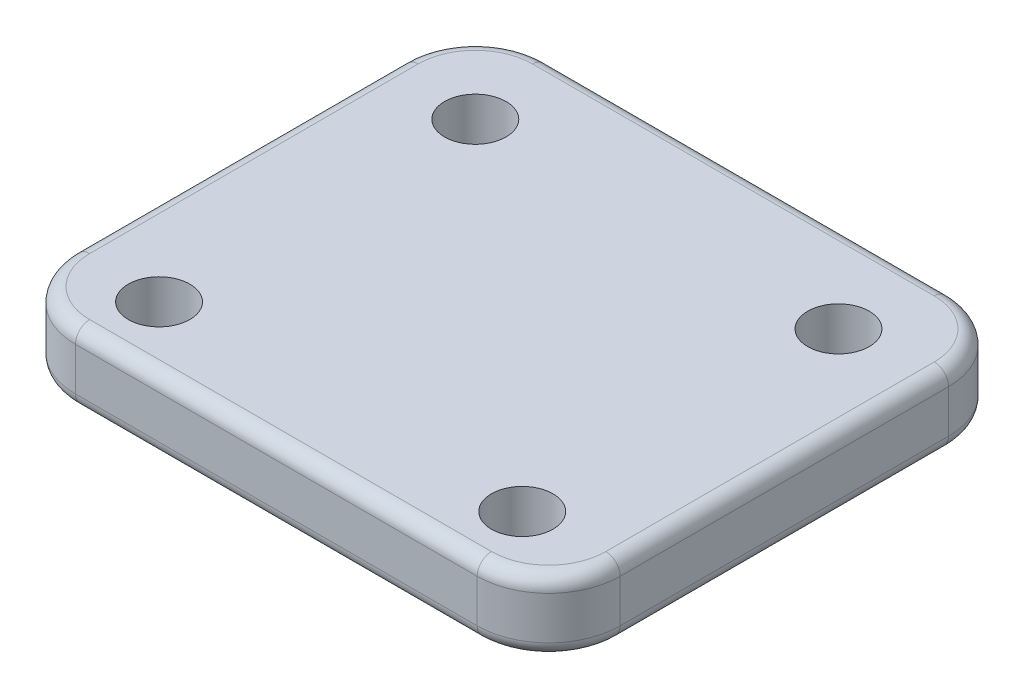
ISO-10303-21;
HEADER;
FILE_DESCRIPTION(('STEP AP214'),'2;1');
FILE_NAME('part.step','',(''),(''),'','','');
FILE_SCHEMA(('AUTOMOTIVE_DESIGN { 1 0 10303 214 1 1 1 1 }'));
ENDSEC;
DATA;
#1=APPLICATION_CONTEXT('core data for automotive mechanical design processes');
#2=APPLICATION_PROTOCOL_DEFINITION('international standard','automotive_design',2000,#1);
#3=PRODUCT_CONTEXT('',#1,'mechanical');
#4=PRODUCT('Part','Part','',(#3));
#5=PRODUCT_RELATED_PRODUCT_CATEGORY('part','',(#4));
#6=PRODUCT_DEFINITION_FORMATION('','',#4);
#7=PRODUCT_DEFINITION_CONTEXT('part definition',#1,'design');
#8=PRODUCT_DEFINITION('design','',#6,#7);
#9=PRODUCT_DEFINITION_SHAPE('','',#8);
#10=(LENGTH_UNIT() NAMED_UNIT(*) SI_UNIT(.MILLI.,.METRE.));
#11=(NAMED_UNIT(*) PLANE_ANGLE_UNIT() SI_UNIT($,.RADIAN.));
#12=(NAMED_UNIT(*) SI_UNIT($,.STERADIAN.) SOLID_ANGLE_UNIT());
#13=UNCERTAINTY_MEASURE_WITH_UNIT(LENGTH_MEASURE(1.E-05),#10,'distance_accuracy_value','');
#14=(GEOMETRIC_REPRESENTATION_CONTEXT(3) GLOBAL_UNCERTAINTY_ASSIGNED_CONTEXT((#13)) GLOBAL_UNIT_ASSIGNED_CONTEXT((#10,
#11,#12)) REPRESENTATION_CONTEXT('',''));
#15=CARTESIAN_POINT('',(0.,0.,0.));
#16=DIRECTION('',(0.,0.,1.));
#17=DIRECTION('',(1.,0.,0.));
#18=AXIS2_PLACEMENT_3D('',#15,#16,#17);
#19=CARTESIAN_POINT('',(0.,5.,0.));
#20=DIRECTION('',(0.,1.,0.));
#21=DIRECTION('',(0.,0.,1.));
#22=AXIS2_PLACEMENT_3D('',#19,#20,#21);
#23=PLANE('',#22);
#24=DIRECTION('',(0.,0.,1.));
#25=VECTOR('',#24,1.);
#26=CARTESIAN_POINT('',(1.,5.,27.97));
#27=LINE('',#26,#25);
#28=CARTESIAN_POINT('',(1.,5.,5.));
#29=VERTEX_POINT('',#28);
#30=CARTESIAN_POINT('',(1.,5.,27.97));
#31=VERTEX_POINT('',#30);
#32=EDGE_CURVE('E57',#29,#31,#27,.T.);
#33=ORIENTED_EDGE('',*,*,#32,.T.);
#34=CARTESIAN_POINT('',(5.,5.,27.97));
#35=DIRECTION('',(0.,1.,0.));
#36=DIRECTION('',(0.,0.,1.));
#37=AXIS2_PLACEMENT_3D('',#34,#35,#36);
#38=CIRCLE('',#37,4.);
#39=CARTESIAN_POINT('',(5.,5.,31.97));
#40=VERTEX_POINT('',#39);
#41=EDGE_CURVE('E270',#31,#40,#38,.T.);
#42=ORIENTED_EDGE('',*,*,#41,.T.);
#43=DIRECTION('',(1.,0.,0.));
#44=VECTOR('',#43,1.);
#45=CARTESIAN_POINT('',(33.1,5.,31.97));
#46=LINE('',#45,#44);
#47=CARTESIAN_POINT('',(33.1,5.,31.97));
#48=VERTEX_POINT('',#47);
#49=EDGE_CURVE('E251',#40,#48,#46,.T.);
#50=ORIENTED_EDGE('',*,*,#49,.T.);
#51=CARTESIAN_POINT('',(33.1,5.,27.97));
#52=DIRECTION('',(0.,1.,0.));
#53=DIRECTION('',(0.,0.,1.));
#54=AXIS2_PLACEMENT_3D('',#51,#52,#53);
#55=CIRCLE('',#54,4.);
#56=CARTESIAN_POINT('',(37.1,5.,27.97));
#57=VERTEX_POINT('',#56);
#58=EDGE_CURVE('E254',#48,#57,#55,.T.);
#59=ORIENTED_EDGE('',*,*,#58,.T.);
#60=DIRECTION('',(0.,0.,-1.));
#61=VECTOR('',#60,1.);
#62=CARTESIAN_POINT('',(37.1,5.,5.));
#63=LINE('',#62,#61);
#64=CARTESIAN_POINT('',(37.1,5.,5.));
#65=VERTEX_POINT('',#64);
#66=EDGE_CURVE('E257',#57,#65,#63,.T.);
#67=ORIENTED_EDGE('',*,*,#66,.T.);
#68=CARTESIAN_POINT('',(33.1,5.,5.));
#69=DIRECTION('',(0.,1.,0.));
#70=DIRECTION('',(0.,0.,1.));
#71=AXIS2_PLACEMENT_3D('',#68,#69,#70);
#72=CIRCLE('',#71,4.);
#73=CARTESIAN_POINT('',(33.1,5.,1.));
#74=VERTEX_POINT('',#73);
#75=EDGE_CURVE('E260',#65,#74,#72,.T.);
#76=ORIENTED_EDGE('',*,*,#75,.T.);
#77=DIRECTION('',(-1.,0.,0.));
#78=VECTOR('',#77,1.);
#79=CARTESIAN_POINT('',(5.,5.,1.));
#80=LINE('',#79,#78);
#81=CARTESIAN_POINT('',(5.,5.,1.));
#82=VERTEX_POINT('',#81);
#83=EDGE_CURVE('E263',#74,#82,#80,.T.);
#84=ORIENTED_EDGE('',*,*,#83,.T.);
#85=CARTESIAN_POINT('',(5.,5.,5.));
#86=DIRECTION('',(0.,1.,0.));
#87=DIRECTION('',(0.,0.,1.));
#88=AXIS2_PLACEMENT_3D('',#85,#86,#87);
#89=CIRCLE('',#88,4.);
#90=EDGE_CURVE('E62',#82,#29,#89,.T.);
#91=ORIENTED_EDGE('',*,*,#90,.T.);
#92=EDGE_LOOP('',(#33,#42,#50,#59,#67,#76,#84,#91));
#93=FACE_BOUND('',#92,.T.);
#94=CARTESIAN_POINT('',(31.7500000000002,5.,28.47));
#95=DIRECTION('',(0.,1.,0.));
#96=DIRECTION('',(0.,0.,1.));
#97=AXIS2_PLACEMENT_3D('',#94,#95,#96);
#98=CIRCLE('',#97,2.15);
#99=CARTESIAN_POINT('',(31.7500000000002,5.,30.62));
#100=VERTEX_POINT('',#99);
#101=EDGE_CURVE('E386',#100,#100,#98,.T.);
#102=ORIENTED_EDGE('',*,*,#101,.F.);
#103=EDGE_LOOP('',(#102));
#104=FACE_BOUND('',#103,.T.);
#105=CARTESIAN_POINT('',(6.35,5.,6.35));
#106=DIRECTION('',(0.,1.,0.));
#107=DIRECTION('',(0.,0.,1.));
#108=AXIS2_PLACEMENT_3D('',#105,#106,#107);
#109=CIRCLE('',#108,2.15);
#110=CARTESIAN_POINT('',(6.35,5.,8.5));
#111=VERTEX_POINT('',#110);
#112=EDGE_CURVE('E373',#111,#111,#109,.T.);
#113=ORIENTED_EDGE('',*,*,#112,.F.);
#114=EDGE_LOOP('',(#113));
#115=FACE_BOUND('',#114,.T.);
#116=CARTESIAN_POINT('',(31.75,5.,6.35));
#117=DIRECTION('',(0.,1.,0.));
#118=DIRECTION('',(0.,0.,1.));
#119=AXIS2_PLACEMENT_3D('',#116,#117,#118);
#120=CIRCLE('',#119,2.15);
#121=CARTESIAN_POINT('',(31.75,5.,8.5));
#122=VERTEX_POINT('',#121);
#123=EDGE_CURVE('E378',#122,#122,#120,.T.);
#124=ORIENTED_EDGE('',*,*,#123,.F.);
#125=EDGE_LOOP('',(#124));
#126=FACE_BOUND('',#125,.T.);
#127=CARTESIAN_POINT('',(6.35000000000023,5.,28.47));
#128=DIRECTION('',(0.,1.,0.));
#129=DIRECTION('',(0.,0.,1.));
#130=AXIS2_PLACEMENT_3D('',#127,#128,#129);
#131=CIRCLE('',#130,2.15);
#132=CARTESIAN_POINT('',(6.35000000000023,5.,30.62));
#133=VERTEX_POINT('',#132);
#134=EDGE_CURVE('E394',#133,#133,#131,.T.);
#135=ORIENTED_EDGE('',*,*,#134,.F.);
#136=EDGE_LOOP('',(#135));
#137=FACE_BOUND('',#136,.T.);
#138=ADVANCED_FACE('F39',(#93,#104,#115,#126,#137),#23,.T.);
#139=CARTESIAN_POINT('',(0.,0.,0.));
#140=DIRECTION('',(0.,1.,0.));
#141=DIRECTION('',(0.,0.,1.));
#142=AXIS2_PLACEMENT_3D('',#139,#140,#141);
#143=PLANE('',#142);
#144=DIRECTION('',(1.,0.,0.));
#145=VECTOR('',#144,1.);
#146=CARTESIAN_POINT('',(0.,0.,31.97));
#147=LINE('',#146,#145);
#148=CARTESIAN_POINT('',(33.1,0.,31.97));
#149=VERTEX_POINT('',#148);
#150=CARTESIAN_POINT('',(5.,0.,31.97));
#151=VERTEX_POINT('',#150);
#152=EDGE_CURVE('E159',#149,#151,#147,.F.);
#153=ORIENTED_EDGE('',*,*,#152,.T.);
#154=CARTESIAN_POINT('',(5.,0.,27.97));
#155=DIRECTION('',(0.,1.,0.));
#156=DIRECTION('',(0.,0.,1.));
#157=AXIS2_PLACEMENT_3D('',#154,#155,#156);
#158=CIRCLE('',#157,4.);
#159=CARTESIAN_POINT('',(1.,0.,27.97));
#160=VERTEX_POINT('',#159);
#161=EDGE_CURVE('E205',#151,#160,#158,.F.);
#162=ORIENTED_EDGE('',*,*,#161,.T.);
#163=DIRECTION('',(0.,0.,1.));
#164=VECTOR('',#163,1.);
#165=CARTESIAN_POINT('',(1.,0.,0.));
#166=LINE('',#165,#164);
#167=CARTESIAN_POINT('',(1.,0.,5.));
#168=VERTEX_POINT('',#167);
#169=EDGE_CURVE('E202',#160,#168,#166,.F.);
#170=ORIENTED_EDGE('',*,*,#169,.T.);
#171=CARTESIAN_POINT('',(5.,0.,5.));
#172=DIRECTION('',(0.,1.,0.));
#173=DIRECTION('',(0.,0.,1.));
#174=AXIS2_PLACEMENT_3D('',#171,#172,#173);
#175=CIRCLE('',#174,4.);
#176=CARTESIAN_POINT('',(5.,0.,1.));
#177=VERTEX_POINT('',#176);
#178=EDGE_CURVE('E199',#168,#177,#175,.F.);
#179=ORIENTED_EDGE('',*,*,#178,.T.);
#180=DIRECTION('',(-1.,0.,0.));
#181=VECTOR('',#180,1.);
#182=CARTESIAN_POINT('',(0.,0.,1.));
#183=LINE('',#182,#181);
#184=CARTESIAN_POINT('',(33.1,0.,1.));
#185=VERTEX_POINT('',#184);
#186=EDGE_CURVE('E196',#177,#185,#183,.F.);
#187=ORIENTED_EDGE('',*,*,#186,.T.);
#188=CARTESIAN_POINT('',(33.1,0.,5.));
#189=DIRECTION('',(0.,1.,0.));
#190=DIRECTION('',(0.,0.,1.));
#191=AXIS2_PLACEMENT_3D('',#188,#189,#190);
#192=CIRCLE('',#191,4.);
#193=CARTESIAN_POINT('',(37.1,0.,5.));
#194=VERTEX_POINT('',#193);
#195=EDGE_CURVE('E193',#185,#194,#192,.F.);
#196=ORIENTED_EDGE('',*,*,#195,.T.);
#197=DIRECTION('',(0.,0.,-1.));
#198=VECTOR('',#197,1.);
#199=CARTESIAN_POINT('',(37.1,0.,0.));
#200=LINE('',#199,#198);
#201=CARTESIAN_POINT('',(37.1,0.,27.97));
#202=VERTEX_POINT('',#201);
#203=EDGE_CURVE('E162',#194,#202,#200,.F.);
#204=ORIENTED_EDGE('',*,*,#203,.T.);
#205=CARTESIAN_POINT('',(33.1,0.,27.97));
#206=DIRECTION('',(0.,1.,0.));
#207=DIRECTION('',(0.,0.,1.));
#208=AXIS2_PLACEMENT_3D('',#205,#206,#207);
#209=CIRCLE('',#208,4.);
#210=EDGE_CURVE('E153',#202,#149,#209,.F.);
#211=ORIENTED_EDGE('',*,*,#210,.T.);
#212=EDGE_LOOP('',(#153,#162,#170,#179,#187,#196,#204,#211));
#213=FACE_BOUND('',#212,.T.);
#214=CARTESIAN_POINT('',(6.35,0.,6.35));
#215=DIRECTION('',(0.,1.,0.));
#216=DIRECTION('',(0.,0.,1.));
#217=AXIS2_PLACEMENT_3D('',#214,#215,#216);
#218=CIRCLE('',#217,2.15);
#219=CARTESIAN_POINT('',(6.35,0.,8.5));
#220=VERTEX_POINT('',#219);
#221=EDGE_CURVE('E374',#220,#220,#218,.T.);
#222=ORIENTED_EDGE('',*,*,#221,.T.);
#223=EDGE_LOOP('',(#222));
#224=FACE_BOUND('',#223,.T.);
#225=CARTESIAN_POINT('',(31.75,0.,6.35));
#226=DIRECTION('',(0.,1.,0.));
#227=DIRECTION('',(0.,0.,1.));
#228=AXIS2_PLACEMENT_3D('',#225,#226,#227);
#229=CIRCLE('',#228,2.15);
#230=CARTESIAN_POINT('',(31.75,0.,8.5));
#231=VERTEX_POINT('',#230);
#232=EDGE_CURVE('E382',#231,#231,#229,.T.);
#233=ORIENTED_EDGE('',*,*,#232,.T.);
#234=EDGE_LOOP('',(#233));
#235=FACE_BOUND('',#234,.T.);
#236=CARTESIAN_POINT('',(31.7500000000002,0.,28.47));
#237=DIRECTION('',(0.,1.,0.));
#238=DIRECTION('',(0.,0.,1.));
#239=AXIS2_PLACEMENT_3D('',#236,#237,#238);
#240=CIRCLE('',#239,2.15);
#241=CARTESIAN_POINT('',(31.7500000000002,0.,30.62));
#242=VERTEX_POINT('',#241);
#243=EDGE_CURVE('E390',#242,#242,#240,.T.);
#244=ORIENTED_EDGE('',*,*,#243,.T.);
#245=EDGE_LOOP('',(#244));
#246=FACE_BOUND('',#245,.T.);
#247=CARTESIAN_POINT('',(6.35000000000023,0.,28.47));
#248=DIRECTION('',(0.,1.,0.));
#249=DIRECTION('',(0.,0.,1.));
#250=AXIS2_PLACEMENT_3D('',#247,#248,#249);
#251=CIRCLE('',#250,2.15);
#252=CARTESIAN_POINT('',(6.35000000000023,0.,30.62));
#253=VERTEX_POINT('',#252);
#254=EDGE_CURVE('E297',#253,#253,#251,.T.);
#255=ORIENTED_EDGE('',*,*,#254,.T.);
#256=EDGE_LOOP('',(#255));
#257=FACE_BOUND('',#256,.T.);
#258=ADVANCED_FACE('F155',(#213,#224,#235,#246,#257),#143,.F.);
#259=CARTESIAN_POINT('',(0.,5.,0.));
#260=DIRECTION('',(1.,0.,0.));
#261=DIRECTION('',(0.,0.,-1.));
#262=AXIS2_PLACEMENT_3D('',#259,#260,#261);
#263=PLANE('',#262);
#264=DIRECTION('',(0.,-1.,0.));
#265=VECTOR('',#264,1.);
#266=CARTESIAN_POINT('',(0.,5.,5.));
#267=LINE('',#266,#265);
#268=CARTESIAN_POINT('',(0.,4.,5.));
#269=VERTEX_POINT('',#268);
#270=CARTESIAN_POINT('',(0.,1.,5.));
#271=VERTEX_POINT('',#270);
#272=EDGE_CURVE('E365',#269,#271,#267,.T.);
#273=ORIENTED_EDGE('',*,*,#272,.T.);
#274=DIRECTION('',(0.,0.,1.));
#275=VECTOR('',#274,1.);
#276=CARTESIAN_POINT('',(0.,1.,0.));
#277=LINE('',#276,#275);
#278=CARTESIAN_POINT('',(0.,1.,27.97));
#279=VERTEX_POINT('',#278);
#280=EDGE_CURVE('E219',#271,#279,#277,.T.);
#281=ORIENTED_EDGE('',*,*,#280,.T.);
#282=DIRECTION('',(0.,-1.,0.));
#283=VECTOR('',#282,1.);
#284=CARTESIAN_POINT('',(0.,5.,27.97));
#285=LINE('',#284,#283);
#286=CARTESIAN_POINT('',(0.,4.,27.97));
#287=VERTEX_POINT('',#286);
#288=EDGE_CURVE('E369',#279,#287,#285,.F.);
#289=ORIENTED_EDGE('',*,*,#288,.T.);
#290=DIRECTION('',(0.,0.,1.));
#291=VECTOR('',#290,1.);
#292=CARTESIAN_POINT('',(0.,4.,5.));
#293=LINE('',#292,#291);
#294=EDGE_CURVE('E216',#287,#269,#293,.F.);
#295=ORIENTED_EDGE('',*,*,#294,.T.);
#296=EDGE_LOOP('',(#273,#281,#289,#295));
#297=FACE_BOUND('',#296,.T.);
#298=ADVANCED_FACE('F413',(#297),#263,.F.);
#299=CARTESIAN_POINT('',(0.,5.,32.97));
#300=DIRECTION('',(0.,0.,-1.));
#301=DIRECTION('',(-1.,0.,0.));
#302=AXIS2_PLACEMENT_3D('',#299,#300,#301);
#303=PLANE('',#302);
#304=DIRECTION('',(0.,-1.,0.));
#305=VECTOR('',#304,1.);
#306=CARTESIAN_POINT('',(5.,5.,32.97));
#307=LINE('',#306,#305);
#308=CARTESIAN_POINT('',(5.,4.,32.97));
#309=VERTEX_POINT('',#308);
#310=CARTESIAN_POINT('',(5.,1.,32.97));
#311=VERTEX_POINT('',#310);
#312=EDGE_CURVE('E187',#309,#311,#307,.T.);
#313=ORIENTED_EDGE('',*,*,#312,.T.);
#314=DIRECTION('',(1.,0.,0.));
#315=VECTOR('',#314,1.);
#316=CARTESIAN_POINT('',(0.,1.,32.97));
#317=LINE('',#316,#315);
#318=CARTESIAN_POINT('',(33.1,1.,32.97));
#319=VERTEX_POINT('',#318);
#320=EDGE_CURVE('E11',#311,#319,#317,.T.);
#321=ORIENTED_EDGE('',*,*,#320,.T.);
#322=DIRECTION('',(0.,-1.,0.));
#323=VECTOR('',#322,1.);
#324=CARTESIAN_POINT('',(33.1,5.,32.97));
#325=LINE('',#324,#323);
#326=CARTESIAN_POINT('',(33.1,4.,32.97));
#327=VERTEX_POINT('',#326);
#328=EDGE_CURVE('E183',#319,#327,#325,.F.);
#329=ORIENTED_EDGE('',*,*,#328,.T.);
#330=DIRECTION('',(1.,0.,0.));
#331=VECTOR('',#330,1.);
#332=CARTESIAN_POINT('',(5.,4.,32.97));
#333=LINE('',#332,#331);
#334=EDGE_CURVE('E49',#327,#309,#333,.F.);
#335=ORIENTED_EDGE('',*,*,#334,.T.);
#336=EDGE_LOOP('',(#313,#321,#329,#335));
#337=FACE_BOUND('',#336,.T.);
#338=ADVANCED_FACE('F426',(#337),#303,.F.);
#339=CARTESIAN_POINT('',(38.1,5.,0.));
#340=DIRECTION('',(-1.,0.,0.));
#341=DIRECTION('',(0.,0.,1.));
#342=AXIS2_PLACEMENT_3D('',#339,#340,#341);
#343=PLANE('',#342);
#344=DIRECTION('',(0.,-1.,0.));
#345=VECTOR('',#344,1.);
#346=CARTESIAN_POINT('',(38.1,5.,27.97));
#347=LINE('',#346,#345);
#348=CARTESIAN_POINT('',(38.1,4.,27.97));
#349=VERTEX_POINT('',#348);
#350=CARTESIAN_POINT('',(38.1,1.,27.97));
#351=VERTEX_POINT('',#350);
#352=EDGE_CURVE('E352',#349,#351,#347,.T.);
#353=ORIENTED_EDGE('',*,*,#352,.T.);
#354=DIRECTION('',(0.,0.,-1.));
#355=VECTOR('',#354,1.);
#356=CARTESIAN_POINT('',(38.1,1.,0.));
#357=LINE('',#356,#355);
#358=CARTESIAN_POINT('',(38.1,1.,5.));
#359=VERTEX_POINT('',#358);
#360=EDGE_CURVE('E243',#351,#359,#357,.T.);
#361=ORIENTED_EDGE('',*,*,#360,.T.);
#362=DIRECTION('',(0.,-1.,0.));
#363=VECTOR('',#362,1.);
#364=CARTESIAN_POINT('',(38.1,5.,5.));
#365=LINE('',#364,#363);
#366=CARTESIAN_POINT('',(38.1,4.,5.));
#367=VERTEX_POINT('',#366);
#368=EDGE_CURVE('E342',#359,#367,#365,.F.);
#369=ORIENTED_EDGE('',*,*,#368,.T.);
#370=DIRECTION('',(0.,0.,-1.));
#371=VECTOR('',#370,1.);
#372=CARTESIAN_POINT('',(38.1,4.,27.97));
#373=LINE('',#372,#371);
#374=EDGE_CURVE('E240',#367,#349,#373,.F.);
#375=ORIENTED_EDGE('',*,*,#374,.T.);
#376=EDGE_LOOP('',(#353,#361,#369,#375));
#377=FACE_BOUND('',#376,.T.);
#378=ADVANCED_FACE('F348',(#377),#343,.F.);
#379=CARTESIAN_POINT('',(0.,5.,0.));
#380=DIRECTION('',(0.,0.,1.));
#381=DIRECTION('',(1.,0.,0.));
#382=AXIS2_PLACEMENT_3D('',#379,#380,#381);
#383=PLANE('',#382);
#384=DIRECTION('',(0.,-1.,0.));
#385=VECTOR('',#384,1.);
#386=CARTESIAN_POINT('',(33.1,5.,0.));
#387=LINE('',#386,#385);
#388=CARTESIAN_POINT('',(33.1,4.,0.));
#389=VERTEX_POINT('',#388);
#390=CARTESIAN_POINT('',(33.1,1.,0.));
#391=VERTEX_POINT('',#390);
#392=EDGE_CURVE('E345',#389,#391,#387,.T.);
#393=ORIENTED_EDGE('',*,*,#392,.T.);
#394=DIRECTION('',(-1.,0.,0.));
#395=VECTOR('',#394,1.);
#396=CARTESIAN_POINT('',(0.,1.,0.));
#397=LINE('',#396,#395);
#398=CARTESIAN_POINT('',(5.,1.,0.));
#399=VERTEX_POINT('',#398);
#400=EDGE_CURVE('E231',#391,#399,#397,.T.);
#401=ORIENTED_EDGE('',*,*,#400,.T.);
#402=DIRECTION('',(0.,-1.,0.));
#403=VECTOR('',#402,1.);
#404=CARTESIAN_POINT('',(5.,5.,0.));
#405=LINE('',#404,#403);
#406=CARTESIAN_POINT('',(5.,4.,0.));
#407=VERTEX_POINT('',#406);
#408=EDGE_CURVE('E357',#399,#407,#405,.F.);
#409=ORIENTED_EDGE('',*,*,#408,.T.);
#410=DIRECTION('',(-1.,0.,0.));
#411=VECTOR('',#410,1.);
#412=CARTESIAN_POINT('',(33.1,4.,0.));
#413=LINE('',#412,#411);
#414=EDGE_CURVE('E228',#407,#389,#413,.F.);
#415=ORIENTED_EDGE('',*,*,#414,.T.);
#416=EDGE_LOOP('',(#393,#401,#409,#415));
#417=FACE_BOUND('',#416,.T.);
#418=ADVANCED_FACE('F420',(#417),#383,.F.);
#419=CARTESIAN_POINT('',(6.35,5.,6.35));
#420=DIRECTION('',(0.,-1.,0.));
#421=DIRECTION('',(0.,0.,-1.));
#422=AXIS2_PLACEMENT_3D('',#419,#420,#421);
#423=CYLINDRICAL_SURFACE('',#422,2.15);
#424=ORIENTED_EDGE('',*,*,#112,.T.);
#425=EDGE_LOOP('',(#424));
#426=FACE_BOUND('',#425,.T.);
#427=ORIENTED_EDGE('',*,*,#221,.F.);
#428=EDGE_LOOP('',(#427));
#429=FACE_BOUND('',#428,.T.);
#430=ADVANCED_FACE('F417',(#426,#429),#423,.F.);
#431=CARTESIAN_POINT('',(31.75,5.,6.35));
#432=DIRECTION('',(0.,-1.,0.));
#433=DIRECTION('',(0.,0.,-1.));
#434=AXIS2_PLACEMENT_3D('',#431,#432,#433);
#435=CYLINDRICAL_SURFACE('',#434,2.15);
#436=ORIENTED_EDGE('',*,*,#123,.T.);
#437=EDGE_LOOP('',(#436));
#438=FACE_BOUND('',#437,.T.);
#439=ORIENTED_EDGE('',*,*,#232,.F.);
#440=EDGE_LOOP('',(#439));
#441=FACE_BOUND('',#440,.T.);
#442=ADVANCED_FACE('F565',(#438,#441),#435,.F.);
#443=CARTESIAN_POINT('',(31.7500000000002,5.,28.47));
#444=DIRECTION('',(0.,-1.,0.));
#445=DIRECTION('',(0.,0.,-1.));
#446=AXIS2_PLACEMENT_3D('',#443,#444,#445);
#447=CYLINDRICAL_SURFACE('',#446,2.15);
#448=ORIENTED_EDGE('',*,*,#101,.T.);
#449=EDGE_LOOP('',(#448));
#450=FACE_BOUND('',#449,.T.);
#451=ORIENTED_EDGE('',*,*,#243,.F.);
#452=EDGE_LOOP('',(#451));
#453=FACE_BOUND('',#452,.T.);
#454=ADVANCED_FACE('F558',(#450,#453),#447,.F.);
#455=CARTESIAN_POINT('',(6.35000000000023,5.,28.47));
#456=DIRECTION('',(0.,-1.,0.));
#457=DIRECTION('',(0.,0.,-1.));
#458=AXIS2_PLACEMENT_3D('',#455,#456,#457);
#459=CYLINDRICAL_SURFACE('',#458,2.15);
#460=ORIENTED_EDGE('',*,*,#134,.T.);
#461=EDGE_LOOP('',(#460));
#462=FACE_BOUND('',#461,.T.);
#463=ORIENTED_EDGE('',*,*,#254,.F.);
#464=EDGE_LOOP('',(#463));
#465=FACE_BOUND('',#464,.T.);
#466=ADVANCED_FACE('F405',(#462,#465),#459,.F.);
#467=CARTESIAN_POINT('',(5.,5.,5.));
#468=DIRECTION('',(0.,-1.,0.));
#469=DIRECTION('',(0.,0.,-1.));
#470=AXIS2_PLACEMENT_3D('',#467,#468,#469);
#471=CYLINDRICAL_SURFACE('',#470,5.);
#472=ORIENTED_EDGE('',*,*,#408,.F.);
#473=CARTESIAN_POINT('',(5.,1.,5.));
#474=DIRECTION('',(0.,1.,0.));
#475=DIRECTION('',(0.,0.,1.));
#476=AXIS2_PLACEMENT_3D('',#473,#474,#475);
#477=CIRCLE('',#476,5.);
#478=EDGE_CURVE('E225',#399,#271,#477,.T.);
#479=ORIENTED_EDGE('',*,*,#478,.T.);
#480=ORIENTED_EDGE('',*,*,#272,.F.);
#481=CARTESIAN_POINT('',(5.,4.,5.));
#482=DIRECTION('',(0.,1.,0.));
#483=DIRECTION('',(0.,0.,1.));
#484=AXIS2_PLACEMENT_3D('',#481,#482,#483);
#485=CIRCLE('',#484,5.);
#486=EDGE_CURVE('E222',#269,#407,#485,.F.);
#487=ORIENTED_EDGE('',*,*,#486,.T.);
#488=EDGE_LOOP('',(#472,#479,#480,#487));
#489=FACE_BOUND('',#488,.T.);
#490=ADVANCED_FACE('F433',(#489),#471,.T.);
#491=CARTESIAN_POINT('',(33.1,5.,5.));
#492=DIRECTION('',(0.,-1.,0.));
#493=DIRECTION('',(0.,0.,-1.));
#494=AXIS2_PLACEMENT_3D('',#491,#492,#493);
#495=CYLINDRICAL_SURFACE('',#494,5.);
#496=ORIENTED_EDGE('',*,*,#368,.F.);
#497=CARTESIAN_POINT('',(33.1,1.,5.));
#498=DIRECTION('',(0.,1.,0.));
#499=DIRECTION('',(0.,0.,1.));
#500=AXIS2_PLACEMENT_3D('',#497,#498,#499);
#501=CIRCLE('',#500,5.);
#502=EDGE_CURVE('E237',#359,#391,#501,.T.);
#503=ORIENTED_EDGE('',*,*,#502,.T.);
#504=ORIENTED_EDGE('',*,*,#392,.F.);
#505=CARTESIAN_POINT('',(33.1,4.,5.));
#506=DIRECTION('',(0.,1.,0.));
#507=DIRECTION('',(0.,0.,1.));
#508=AXIS2_PLACEMENT_3D('',#505,#506,#507);
#509=CIRCLE('',#508,5.);
#510=EDGE_CURVE('E234',#389,#367,#509,.F.);
#511=ORIENTED_EDGE('',*,*,#510,.T.);
#512=EDGE_LOOP('',(#496,#503,#504,#511));
#513=FACE_BOUND('',#512,.T.);
#514=ADVANCED_FACE('F341',(#513),#495,.T.);
#515=CARTESIAN_POINT('',(33.1,5.,27.97));
#516=DIRECTION('',(0.,-1.,0.));
#517=DIRECTION('',(0.,0.,-1.));
#518=AXIS2_PLACEMENT_3D('',#515,#516,#517);
#519=CYLINDRICAL_SURFACE('',#518,5.);
#520=ORIENTED_EDGE('',*,*,#328,.F.);
#521=CARTESIAN_POINT('',(33.1,1.,27.97));
#522=DIRECTION('',(0.,1.,0.));
#523=DIRECTION('',(0.,0.,1.));
#524=AXIS2_PLACEMENT_3D('',#521,#522,#523);
#525=CIRCLE('',#524,5.);
#526=EDGE_CURVE('E172',#319,#351,#525,.T.);
#527=ORIENTED_EDGE('',*,*,#526,.T.);
#528=ORIENTED_EDGE('',*,*,#352,.F.);
#529=CARTESIAN_POINT('',(33.1,4.,27.97));
#530=DIRECTION('',(0.,1.,0.));
#531=DIRECTION('',(0.,0.,1.));
#532=AXIS2_PLACEMENT_3D('',#529,#530,#531);
#533=CIRCLE('',#532,5.);
#534=EDGE_CURVE('E246',#349,#327,#533,.F.);
#535=ORIENTED_EDGE('',*,*,#534,.T.);
#536=EDGE_LOOP('',(#520,#527,#528,#535));
#537=FACE_BOUND('',#536,.T.);
#538=ADVANCED_FACE('F439',(#537),#519,.T.);
#539=CARTESIAN_POINT('',(5.,5.,27.97));
#540=DIRECTION('',(0.,-1.,0.));
#541=DIRECTION('',(0.,0.,-1.));
#542=AXIS2_PLACEMENT_3D('',#539,#540,#541);
#543=CYLINDRICAL_SURFACE('',#542,5.);
#544=ORIENTED_EDGE('',*,*,#288,.F.);
#545=CARTESIAN_POINT('',(5.,1.,27.97));
#546=DIRECTION('',(0.,1.,0.));
#547=DIRECTION('',(0.,0.,1.));
#548=AXIS2_PLACEMENT_3D('',#545,#546,#547);
#549=CIRCLE('',#548,5.);
#550=EDGE_CURVE('E212',#279,#311,#549,.T.);
#551=ORIENTED_EDGE('',*,*,#550,.T.);
#552=ORIENTED_EDGE('',*,*,#312,.F.);
#553=CARTESIAN_POINT('',(5.,4.,27.97));
#554=DIRECTION('',(0.,1.,0.));
#555=DIRECTION('',(0.,0.,1.));
#556=AXIS2_PLACEMENT_3D('',#553,#554,#555);
#557=CIRCLE('',#556,5.);
#558=EDGE_CURVE('E208',#309,#287,#557,.F.);
#559=ORIENTED_EDGE('',*,*,#558,.T.);
#560=EDGE_LOOP('',(#544,#551,#552,#559));
#561=FACE_BOUND('',#560,.T.);
#562=ADVANCED_FACE('F442',(#561),#543,.T.);
#563=CARTESIAN_POINT('',(33.1,1.,5.));
#564=DIRECTION('',(0.,1.,0.));
#565=DIRECTION('',(0.,0.,1.));
#566=AXIS2_PLACEMENT_3D('',#563,#564,#565);
#567=TOROIDAL_SURFACE('',#566,4.,1.);
#568=CARTESIAN_POINT('',(33.1,1.,1.));
#569=DIRECTION('',(-1.,0.,0.));
#570=DIRECTION('',(0.,0.,1.));
#571=AXIS2_PLACEMENT_3D('',#568,#569,#570);
#572=CIRCLE('',#571,1.);
#573=EDGE_CURVE('E289',#391,#185,#572,.T.);
#574=ORIENTED_EDGE('',*,*,#573,.F.);
#575=ORIENTED_EDGE('',*,*,#502,.F.);
#576=CARTESIAN_POINT('',(37.1,1.,5.));
#577=DIRECTION('',(0.,0.,1.));
#578=DIRECTION('',(1.,0.,0.));
#579=AXIS2_PLACEMENT_3D('',#576,#577,#578);
#580=CIRCLE('',#579,1.);
#581=EDGE_CURVE('E293',#194,#359,#580,.T.);
#582=ORIENTED_EDGE('',*,*,#581,.F.);
#583=ORIENTED_EDGE('',*,*,#195,.F.);
#584=EDGE_LOOP('',(#574,#575,#582,#583));
#585=FACE_BOUND('',#584,.T.);
#586=ADVANCED_FACE('F446',(#585),#567,.T.);
#587=CARTESIAN_POINT('',(37.1,1.,0.));
#588=DIRECTION('',(0.,0.,-1.));
#589=DIRECTION('',(-1.,0.,0.));
#590=AXIS2_PLACEMENT_3D('',#587,#588,#589);
#591=CYLINDRICAL_SURFACE('',#590,1.);
#592=ORIENTED_EDGE('',*,*,#581,.T.);
#593=ORIENTED_EDGE('',*,*,#360,.F.);
#594=CARTESIAN_POINT('',(37.1,1.,27.97));
#595=DIRECTION('',(0.,0.,1.));
#596=DIRECTION('',(1.,0.,0.));
#597=AXIS2_PLACEMENT_3D('',#594,#595,#596);
#598=CIRCLE('',#597,1.);
#599=EDGE_CURVE('E286',#202,#351,#598,.T.);
#600=ORIENTED_EDGE('',*,*,#599,.F.);
#601=ORIENTED_EDGE('',*,*,#203,.F.);
#602=EDGE_LOOP('',(#592,#593,#600,#601));
#603=FACE_BOUND('',#602,.T.);
#604=ADVANCED_FACE('F467',(#603),#591,.T.);
#605=CARTESIAN_POINT('',(0.,1.,1.));
#606=DIRECTION('',(-1.,0.,0.));
#607=DIRECTION('',(0.,0.,1.));
#608=AXIS2_PLACEMENT_3D('',#605,#606,#607);
#609=CYLINDRICAL_SURFACE('',#608,1.);
#610=ORIENTED_EDGE('',*,*,#573,.T.);
#611=ORIENTED_EDGE('',*,*,#186,.F.);
#612=CARTESIAN_POINT('',(5.,1.,1.));
#613=DIRECTION('',(-1.,0.,0.));
#614=DIRECTION('',(0.,0.,1.));
#615=AXIS2_PLACEMENT_3D('',#612,#613,#614);
#616=CIRCLE('',#615,1.);
#617=EDGE_CURVE('E176',#399,#177,#616,.T.);
#618=ORIENTED_EDGE('',*,*,#617,.F.);
#619=ORIENTED_EDGE('',*,*,#400,.F.);
#620=EDGE_LOOP('',(#610,#611,#618,#619));
#621=FACE_BOUND('',#620,.T.);
#622=ADVANCED_FACE('F464',(#621),#609,.T.);
#623=CARTESIAN_POINT('',(33.1,1.,27.97));
#624=DIRECTION('',(0.,1.,0.));
#625=DIRECTION('',(0.,0.,1.));
#626=AXIS2_PLACEMENT_3D('',#623,#624,#625);
#627=TOROIDAL_SURFACE('',#626,4.,1.);
#628=ORIENTED_EDGE('',*,*,#599,.T.);
#629=ORIENTED_EDGE('',*,*,#526,.F.);
#630=CARTESIAN_POINT('',(33.1,1.,31.97));
#631=DIRECTION('',(-1.,0.,0.));
#632=DIRECTION('',(0.,0.,1.));
#633=AXIS2_PLACEMENT_3D('',#630,#631,#632);
#634=CIRCLE('',#633,1.);
#635=EDGE_CURVE('E170',#149,#319,#634,.T.);
#636=ORIENTED_EDGE('',*,*,#635,.F.);
#637=ORIENTED_EDGE('',*,*,#210,.F.);
#638=EDGE_LOOP('',(#628,#629,#636,#637));
#639=FACE_BOUND('',#638,.T.);
#640=ADVANCED_FACE('F171',(#639),#627,.T.);
#641=CARTESIAN_POINT('',(5.,1.,5.));
#642=DIRECTION('',(0.,1.,0.));
#643=DIRECTION('',(0.,0.,1.));
#644=AXIS2_PLACEMENT_3D('',#641,#642,#643);
#645=TOROIDAL_SURFACE('',#644,4.,1.);
#646=ORIENTED_EDGE('',*,*,#617,.T.);
#647=ORIENTED_EDGE('',*,*,#178,.F.);
#648=CARTESIAN_POINT('',(1.,1.,5.));
#649=DIRECTION('',(0.,0.,1.));
#650=DIRECTION('',(1.,0.,0.));
#651=AXIS2_PLACEMENT_3D('',#648,#649,#650);
#652=CIRCLE('',#651,1.);
#653=EDGE_CURVE('E177',#271,#168,#652,.T.);
#654=ORIENTED_EDGE('',*,*,#653,.F.);
#655=ORIENTED_EDGE('',*,*,#478,.F.);
#656=EDGE_LOOP('',(#646,#647,#654,#655));
#657=FACE_BOUND('',#656,.T.);
#658=ADVANCED_FACE('F458',(#657),#645,.T.);
#659=CARTESIAN_POINT('',(0.,1.,31.97));
#660=DIRECTION('',(1.,0.,0.));
#661=DIRECTION('',(0.,0.,-1.));
#662=AXIS2_PLACEMENT_3D('',#659,#660,#661);
#663=CYLINDRICAL_SURFACE('',#662,1.);
#664=ORIENTED_EDGE('',*,*,#635,.T.);
#665=ORIENTED_EDGE('',*,*,#320,.F.);
#666=CARTESIAN_POINT('',(5.,1.,31.97));
#667=DIRECTION('',(-1.,0.,0.));
#668=DIRECTION('',(0.,0.,1.));
#669=AXIS2_PLACEMENT_3D('',#666,#667,#668);
#670=CIRCLE('',#669,1.);
#671=EDGE_CURVE('E180',#151,#311,#670,.T.);
#672=ORIENTED_EDGE('',*,*,#671,.F.);
#673=ORIENTED_EDGE('',*,*,#152,.F.);
#674=EDGE_LOOP('',(#664,#665,#672,#673));
#675=FACE_BOUND('',#674,.T.);
#676=ADVANCED_FACE('F179',(#675),#663,.T.);
#677=CARTESIAN_POINT('',(1.,1.,0.));
#678=DIRECTION('',(0.,0.,1.));
#679=DIRECTION('',(1.,0.,0.));
#680=AXIS2_PLACEMENT_3D('',#677,#678,#679);
#681=CYLINDRICAL_SURFACE('',#680,1.);
#682=ORIENTED_EDGE('',*,*,#653,.T.);
#683=ORIENTED_EDGE('',*,*,#169,.F.);
#684=CARTESIAN_POINT('',(1.,1.,27.97));
#685=DIRECTION('',(0.,0.,1.));
#686=DIRECTION('',(1.,0.,0.));
#687=AXIS2_PLACEMENT_3D('',#684,#685,#686);
#688=CIRCLE('',#687,1.);
#689=EDGE_CURVE('E275',#279,#160,#688,.T.);
#690=ORIENTED_EDGE('',*,*,#689,.F.);
#691=ORIENTED_EDGE('',*,*,#280,.F.);
#692=EDGE_LOOP('',(#682,#683,#690,#691));
#693=FACE_BOUND('',#692,.T.);
#694=ADVANCED_FACE('F451',(#693),#681,.T.);
#695=CARTESIAN_POINT('',(5.,1.,27.97));
#696=DIRECTION('',(0.,1.,0.));
#697=DIRECTION('',(0.,0.,1.));
#698=AXIS2_PLACEMENT_3D('',#695,#696,#697);
#699=TOROIDAL_SURFACE('',#698,4.,1.);
#700=ORIENTED_EDGE('',*,*,#671,.T.);
#701=ORIENTED_EDGE('',*,*,#550,.F.);
#702=ORIENTED_EDGE('',*,*,#689,.T.);
#703=ORIENTED_EDGE('',*,*,#161,.F.);
#704=EDGE_LOOP('',(#700,#701,#702,#703));
#705=FACE_BOUND('',#704,.T.);
#706=ADVANCED_FACE('F448',(#705),#699,.T.);
#707=CARTESIAN_POINT('',(33.1,4.,5.));
#708=DIRECTION('',(0.,1.,0.));
#709=DIRECTION('',(0.,0.,1.));
#710=AXIS2_PLACEMENT_3D('',#707,#708,#709);
#711=TOROIDAL_SURFACE('',#710,4.,1.);
#712=CARTESIAN_POINT('',(37.1,4.,5.));
#713=DIRECTION('',(0.,0.,1.));
#714=DIRECTION('',(1.,0.,0.));
#715=AXIS2_PLACEMENT_3D('',#712,#713,#714);
#716=CIRCLE('',#715,1.);
#717=EDGE_CURVE('E319',#367,#65,#716,.T.);
#718=ORIENTED_EDGE('',*,*,#717,.F.);
#719=ORIENTED_EDGE('',*,*,#510,.F.);
#720=CARTESIAN_POINT('',(33.1,4.,1.));
#721=DIRECTION('',(-1.,0.,0.));
#722=DIRECTION('',(0.,0.,1.));
#723=AXIS2_PLACEMENT_3D('',#720,#721,#722);
#724=CIRCLE('',#723,1.);
#725=EDGE_CURVE('E43',#74,#389,#724,.T.);
#726=ORIENTED_EDGE('',*,*,#725,.F.);
#727=ORIENTED_EDGE('',*,*,#75,.F.);
#728=EDGE_LOOP('',(#718,#719,#726,#727));
#729=FACE_BOUND('',#728,.T.);
#730=ADVANCED_FACE('F41',(#729),#711,.T.);
#731=CARTESIAN_POINT('',(0.,4.,1.));
#732=DIRECTION('',(1.,0.,0.));
#733=DIRECTION('',(0.,0.,-1.));
#734=AXIS2_PLACEMENT_3D('',#731,#732,#733);
#735=CYLINDRICAL_SURFACE('',#734,1.);
#736=ORIENTED_EDGE('',*,*,#725,.T.);
#737=ORIENTED_EDGE('',*,*,#414,.F.);
#738=CARTESIAN_POINT('',(5.,4.,1.));
#739=DIRECTION('',(-1.,0.,0.));
#740=DIRECTION('',(0.,0.,1.));
#741=AXIS2_PLACEMENT_3D('',#738,#739,#740);
#742=CIRCLE('',#741,1.);
#743=EDGE_CURVE('E316',#82,#407,#742,.T.);
#744=ORIENTED_EDGE('',*,*,#743,.F.);
#745=ORIENTED_EDGE('',*,*,#83,.F.);
#746=EDGE_LOOP('',(#736,#737,#744,#745));
#747=FACE_BOUND('',#746,.T.);
#748=ADVANCED_FACE('F332',(#747),#735,.T.);
#749=CARTESIAN_POINT('',(37.1,4.,0.));
#750=DIRECTION('',(0.,0.,1.));
#751=DIRECTION('',(1.,0.,0.));
#752=AXIS2_PLACEMENT_3D('',#749,#750,#751);
#753=CYLINDRICAL_SURFACE('',#752,1.);
#754=ORIENTED_EDGE('',*,*,#717,.T.);
#755=ORIENTED_EDGE('',*,*,#66,.F.);
#756=CARTESIAN_POINT('',(37.1,4.,27.97));
#757=DIRECTION('',(0.,0.,1.));
#758=DIRECTION('',(1.,0.,0.));
#759=AXIS2_PLACEMENT_3D('',#756,#757,#758);
#760=CIRCLE('',#759,1.);
#761=EDGE_CURVE('E312',#349,#57,#760,.T.);
#762=ORIENTED_EDGE('',*,*,#761,.F.);
#763=ORIENTED_EDGE('',*,*,#374,.F.);
#764=EDGE_LOOP('',(#754,#755,#762,#763));
#765=FACE_BOUND('',#764,.T.);
#766=ADVANCED_FACE('F494',(#765),#753,.T.);
#767=CARTESIAN_POINT('',(5.,4.,5.));
#768=DIRECTION('',(0.,1.,0.));
#769=DIRECTION('',(0.,0.,1.));
#770=AXIS2_PLACEMENT_3D('',#767,#768,#769);
#771=TOROIDAL_SURFACE('',#770,4.,1.);
#772=ORIENTED_EDGE('',*,*,#743,.T.);
#773=ORIENTED_EDGE('',*,*,#486,.F.);
#774=CARTESIAN_POINT('',(1.,4.,5.));
#775=DIRECTION('',(0.,0.,1.));
#776=DIRECTION('',(1.,0.,0.));
#777=AXIS2_PLACEMENT_3D('',#774,#775,#776);
#778=CIRCLE('',#777,1.);
#779=EDGE_CURVE('E308',#29,#269,#778,.T.);
#780=ORIENTED_EDGE('',*,*,#779,.F.);
#781=ORIENTED_EDGE('',*,*,#90,.F.);
#782=EDGE_LOOP('',(#772,#773,#780,#781));
#783=FACE_BOUND('',#782,.T.);
#784=ADVANCED_FACE('F490',(#783),#771,.T.);
#785=CARTESIAN_POINT('',(33.1,4.,27.97));
#786=DIRECTION('',(0.,1.,0.));
#787=DIRECTION('',(0.,0.,1.));
#788=AXIS2_PLACEMENT_3D('',#785,#786,#787);
#789=TOROIDAL_SURFACE('',#788,4.,1.);
#790=ORIENTED_EDGE('',*,*,#761,.T.);
#791=ORIENTED_EDGE('',*,*,#58,.F.);
#792=CARTESIAN_POINT('',(33.1,4.,31.97));
#793=DIRECTION('',(-1.,0.,0.));
#794=DIRECTION('',(0.,0.,1.));
#795=AXIS2_PLACEMENT_3D('',#792,#793,#794);
#796=CIRCLE('',#795,1.);
#797=EDGE_CURVE('E304',#327,#48,#796,.T.);
#798=ORIENTED_EDGE('',*,*,#797,.F.);
#799=ORIENTED_EDGE('',*,*,#534,.F.);
#800=EDGE_LOOP('',(#790,#791,#798,#799));
#801=FACE_BOUND('',#800,.T.);
#802=ADVANCED_FACE('F486',(#801),#789,.T.);
#803=CARTESIAN_POINT('',(1.,4.,0.));
#804=DIRECTION('',(0.,0.,-1.));
#805=DIRECTION('',(-1.,0.,0.));
#806=AXIS2_PLACEMENT_3D('',#803,#804,#805);
#807=CYLINDRICAL_SURFACE('',#806,1.);
#808=ORIENTED_EDGE('',*,*,#779,.T.);
#809=ORIENTED_EDGE('',*,*,#294,.F.);
#810=CARTESIAN_POINT('',(1.,4.,27.97));
#811=DIRECTION('',(0.,0.,1.));
#812=DIRECTION('',(1.,0.,0.));
#813=AXIS2_PLACEMENT_3D('',#810,#811,#812);
#814=CIRCLE('',#813,1.);
#815=EDGE_CURVE('E301',#31,#287,#814,.T.);
#816=ORIENTED_EDGE('',*,*,#815,.F.);
#817=ORIENTED_EDGE('',*,*,#32,.F.);
#818=EDGE_LOOP('',(#808,#809,#816,#817));
#819=FACE_BOUND('',#818,.T.);
#820=ADVANCED_FACE('F482',(#819),#807,.T.);
#821=CARTESIAN_POINT('',(0.,4.,31.97));
#822=DIRECTION('',(-1.,0.,0.));
#823=DIRECTION('',(0.,0.,1.));
#824=AXIS2_PLACEMENT_3D('',#821,#822,#823);
#825=CYLINDRICAL_SURFACE('',#824,1.);
#826=ORIENTED_EDGE('',*,*,#797,.T.);
#827=ORIENTED_EDGE('',*,*,#49,.F.);
#828=CARTESIAN_POINT('',(5.,4.,31.97));
#829=DIRECTION('',(-1.,0.,0.));
#830=DIRECTION('',(0.,0.,1.));
#831=AXIS2_PLACEMENT_3D('',#828,#829,#830);
#832=CIRCLE('',#831,1.);
#833=EDGE_CURVE('E298',#309,#40,#832,.T.);
#834=ORIENTED_EDGE('',*,*,#833,.F.);
#835=ORIENTED_EDGE('',*,*,#334,.F.);
#836=EDGE_LOOP('',(#826,#827,#834,#835));
#837=FACE_BOUND('',#836,.T.);
#838=ADVANCED_FACE('F478',(#837),#825,.T.);
#839=CARTESIAN_POINT('',(5.,4.,27.97));
#840=DIRECTION('',(0.,1.,0.));
#841=DIRECTION('',(0.,0.,1.));
#842=AXIS2_PLACEMENT_3D('',#839,#840,#841);
#843=TOROIDAL_SURFACE('',#842,4.,1.);
#844=ORIENTED_EDGE('',*,*,#815,.T.);
#845=ORIENTED_EDGE('',*,*,#558,.F.);
#846=ORIENTED_EDGE('',*,*,#833,.T.);
#847=ORIENTED_EDGE('',*,*,#41,.F.);
#848=EDGE_LOOP('',(#844,#845,#846,#847));
#849=FACE_BOUND('',#848,.T.);
#850=ADVANCED_FACE('F475',(#849),#843,.T.);
#851=CLOSED_SHELL('',(#138,#258,#298,#338,#378,#418,#430,#442,#454,#466,#490,#514,#538,#562,
#586,#604,#622,#640,#658,#676,#694,#706,#730,#748,#766,#784,#802,#820,#838,#850));
#852=MANIFOLD_SOLID_BREP('B2',#851);
#853=ADVANCED_BREP_SHAPE_REPRESENTATION('',(#18,#852),#14);
#854=SHAPE_DEFINITION_REPRESENTATION(#9,#853);
ENDSEC;
END-ISO-10303-21;
